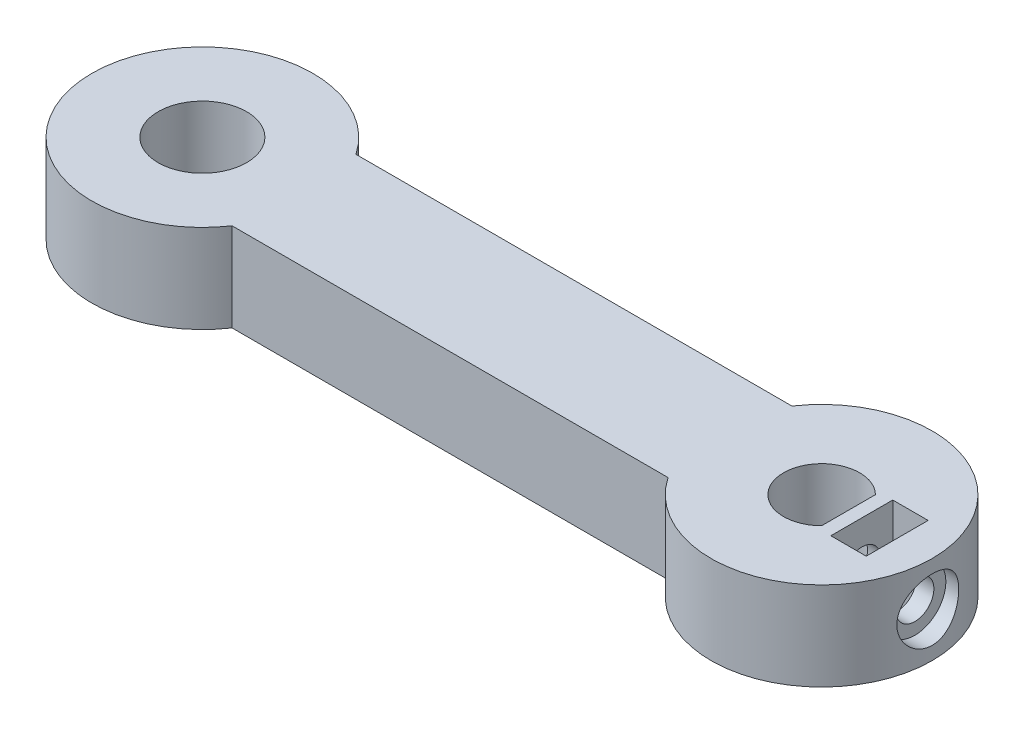
ISO-10303-21;
HEADER;
FILE_DESCRIPTION(('STEP AP214'),'2;1');
FILE_NAME('part.step','',(''),(''),'','','');
FILE_SCHEMA(('AUTOMOTIVE_DESIGN { 1 0 10303 214 1 1 1 1 }'));
ENDSEC;
DATA;
#1=APPLICATION_CONTEXT('core data for automotive mechanical design processes');
#2=APPLICATION_PROTOCOL_DEFINITION('international standard','automotive_design',2000,#1);
#3=PRODUCT_CONTEXT('',#1,'mechanical');
#4=PRODUCT('Part','Part','',(#3));
#5=PRODUCT_RELATED_PRODUCT_CATEGORY('part','',(#4));
#6=PRODUCT_DEFINITION_FORMATION('','',#4);
#7=PRODUCT_DEFINITION_CONTEXT('part definition',#1,'design');
#8=PRODUCT_DEFINITION('design','',#6,#7);
#9=PRODUCT_DEFINITION_SHAPE('','',#8);
#10=(LENGTH_UNIT() NAMED_UNIT(*) SI_UNIT(.MILLI.,.METRE.));
#11=(NAMED_UNIT(*) PLANE_ANGLE_UNIT() SI_UNIT($,.RADIAN.));
#12=(NAMED_UNIT(*) SI_UNIT($,.STERADIAN.) SOLID_ANGLE_UNIT());
#13=UNCERTAINTY_MEASURE_WITH_UNIT(LENGTH_MEASURE(1.E-05),#10,'distance_accuracy_value','');
#14=(GEOMETRIC_REPRESENTATION_CONTEXT(3) GLOBAL_UNCERTAINTY_ASSIGNED_CONTEXT((#13)) GLOBAL_UNIT_ASSIGNED_CONTEXT((#10,
#11,#12)) REPRESENTATION_CONTEXT('',''));
#15=CARTESIAN_POINT('',(0.,0.,0.));
#16=DIRECTION('',(0.,0.,1.));
#17=DIRECTION('',(1.,0.,0.));
#18=AXIS2_PLACEMENT_3D('',#15,#16,#17);
#19=CARTESIAN_POINT('',(82.5,5.,0.));
#20=DIRECTION('',(-1.,0.,0.));
#21=DIRECTION('',(0.,0.,1.));
#22=AXIS2_PLACEMENT_3D('',#19,#20,#21);
#23=CYLINDRICAL_SURFACE('',#22,2.15);
#24=CARTESIAN_POINT('',(74.5405591591022,5.,0.));
#25=DIRECTION('',(-1.,0.,0.));
#26=DIRECTION('',(0.,0.,1.));
#27=AXIS2_PLACEMENT_3D('',#24,#25,#26);
#28=CIRCLE('',#27,2.15);
#29=CARTESIAN_POINT('',(74.5405591591022,5.,2.15));
#30=VERTEX_POINT('',#29);
#31=EDGE_CURVE('E171',#30,#30,#28,.F.);
#32=ORIENTED_EDGE('',*,*,#31,.T.);
#33=EDGE_LOOP('',(#32));
#34=FACE_BOUND('',#33,.T.);
#35=CARTESIAN_POINT('',(73.0405591591022,5.,0.));
#36=DIRECTION('',(-1.,0.,0.));
#37=DIRECTION('',(0.,0.,1.));
#38=AXIS2_PLACEMENT_3D('',#35,#36,#37);
#39=CIRCLE('',#38,2.15);
#40=CARTESIAN_POINT('',(73.0405591591022,5.,2.15));
#41=VERTEX_POINT('',#40);
#42=EDGE_CURVE('E166',#41,#41,#39,.T.);
#43=ORIENTED_EDGE('',*,*,#42,.T.);
#44=EDGE_LOOP('',(#43));
#45=FACE_BOUND('',#44,.T.);
#46=ADVANCED_FACE('F40',(#34,#45),#23,.F.);
#47=CARTESIAN_POINT('',(70.,10.,0.));
#48=DIRECTION('',(0.,-1.,0.));
#49=DIRECTION('',(0.,0.,-1.));
#50=AXIS2_PLACEMENT_3D('',#47,#48,#49);
#51=CYLINDRICAL_SURFACE('',#50,12.5);
#52=CARTESIAN_POINT('',(82.,5.,3.5));
#53=CARTESIAN_POINT('',(82.0000029182384,5.19241482471694,3.49999615237465));
#54=CARTESIAN_POINT('',(82.0046785544293,5.38486904113279,3.48407876334716));
#55=CARTESIAN_POINT('',(82.0228128498503,5.76419285408233,3.4209669850466));
#56=CARTESIAN_POINT('',(82.0362753342026,5.95105998135639,3.37375897408939));
#57=CARTESIAN_POINT('',(82.0703417038929,6.31366626686079,3.24976086719817));
#58=CARTESIAN_POINT('',(82.090934840205,6.4894217063548,3.17301527806614));
#59=CARTESIAN_POINT('',(82.136928168491,6.82559653988916,2.99226282033337));
#60=CARTESIAN_POINT('',(82.1623288716688,6.98601430029293,2.88825305219341));
#61=CARTESIAN_POINT('',(82.2158603074866,7.29138245972694,2.65285688670778));
#62=CARTESIAN_POINT('',(82.2440433222755,7.43584740987041,2.52085249343853));
#63=CARTESIAN_POINT('',(82.2995144458836,7.70090525334718,2.23454150476459));
#64=CARTESIAN_POINT('',(82.3268024534156,7.82149545251975,2.08023239576612));
#65=CARTESIAN_POINT('',(82.3779964293708,8.03743724729167,1.75029227363635));
#66=CARTESIAN_POINT('',(82.4018335593885,8.13230144101637,1.57433065035375));
#67=CARTESIAN_POINT('',(82.4428371907732,8.29091151371921,1.20817457795226));
#68=CARTESIAN_POINT('',(82.4600049370697,8.35466320083208,1.01798279299538));
#69=CARTESIAN_POINT('',(82.4853656892475,8.44765379209681,0.633837060621716));
#70=CARTESIAN_POINT('',(82.4937733520519,8.47771960102609,0.440097705604599));
#71=CARTESIAN_POINT('',(82.5014192399288,8.50509163122306,0.0501545766813506));
#72=CARTESIAN_POINT('',(82.5006591508232,8.50240387541411,-0.146048737508466));
#73=CARTESIAN_POINT('',(82.4902103188576,8.4649168611338,-0.529577185864376));
#74=CARTESIAN_POINT('',(82.4807702097015,8.43101176722193,-0.71699753814503));
#75=CARTESIAN_POINT('',(82.4543187948504,8.3335032678199,-1.08337362960878));
#76=CARTESIAN_POINT('',(82.4373070367162,8.2698980876089,-1.26232886225703));
#77=CARTESIAN_POINT('',(82.3972647344828,8.11414101074105,-1.60891633543912));
#78=CARTESIAN_POINT('',(82.3741720778001,8.0216925844915,-1.77640784364429));
#79=CARTESIAN_POINT('',(82.3244414260413,7.81110340010356,-2.09379770763226));
#80=CARTESIAN_POINT('',(82.2978026803105,7.69295719875908,-2.24369232573499));
#81=CARTESIAN_POINT('',(82.2427920342732,7.42962076074637,-2.52697175983478));
#82=CARTESIAN_POINT('',(82.2143919832095,7.28365235983582,-2.659628625146));
#83=CARTESIAN_POINT('',(82.1598610870606,6.97125218923845,-2.89876928059095));
#84=CARTESIAN_POINT('',(82.1337304113857,6.80481889407119,-3.00525111782679));
#85=CARTESIAN_POINT('',(82.0865750163485,6.45450555003066,-3.18965050384757));
#86=CARTESIAN_POINT('',(82.0655895187615,6.27050549056501,-3.2673508087337));
#87=CARTESIAN_POINT('',(82.0315777632379,5.89131574546498,-3.39046632280532));
#88=CARTESIAN_POINT('',(82.0185492959839,5.69612918230984,-3.43589049422665));
#89=CARTESIAN_POINT('',(82.0024030241429,5.30696224337218,-3.49186889507213));
#90=CARTESIAN_POINT('',(81.9989744317497,5.11315195446068,-3.50351705492387));
#91=CARTESIAN_POINT('',(82.0015622285673,4.72634886830408,-3.49464270434572));
#92=CARTESIAN_POINT('',(82.0075774936583,4.53335597650443,-3.4741240227947));
#93=CARTESIAN_POINT('',(82.028073112858,4.15801314672978,-3.4024668578895));
#94=CARTESIAN_POINT('',(82.04236656542,3.97552303760434,-3.35200384613666));
#95=CARTESIAN_POINT('',(82.0776211582942,3.6216020678571,-3.22265905357544));
#96=CARTESIAN_POINT('',(82.0985832334134,3.45017276179303,-3.14377328826114));
#97=CARTESIAN_POINT('',(82.1454373448376,3.11871217063697,-2.95765848560496));
#98=CARTESIAN_POINT('',(82.1714352674676,2.9590513899883,-2.84979689170067));
#99=CARTESIAN_POINT('',(82.2251912476975,2.65969475593594,-2.60956338877969));
#100=CARTESIAN_POINT('',(82.252949670482,2.52000306444997,-2.4771863834684));
#101=CARTESIAN_POINT('',(82.3081829234522,2.259915272377,-2.18658730527812));
#102=CARTESIAN_POINT('',(82.3356197147011,2.14028705083794,-2.02766922094411));
#103=CARTESIAN_POINT('',(82.3862060696637,1.92939507383442,-1.69138037520718));
#104=CARTESIAN_POINT('',(82.4093558598585,1.8381298197905,-1.51401058937542));
#105=CARTESIAN_POINT('',(82.4486113106072,1.68741794147627,-1.14709270155203));
#106=CARTESIAN_POINT('',(82.4647700697764,1.62773067267032,-0.957649404949926));
#107=CARTESIAN_POINT('',(82.4884571543435,1.54119701909795,-0.570896024719841));
#108=CARTESIAN_POINT('',(82.4959876046799,1.51434254831889,-0.373587890397937));
#109=CARTESIAN_POINT('',(82.5014579192325,1.49478600879999,0.0161518687345293));
#110=CARTESIAN_POINT('',(82.4997126237562,1.50096282659091,0.208523574951645));
#111=CARTESIAN_POINT('',(82.4875511892792,1.54466064769149,0.589378135061154));
#112=CARTESIAN_POINT('',(82.4771354371761,1.5821802524079,0.777861162091557));
#113=CARTESIAN_POINT('',(82.4488768980247,1.68683976736079,1.14409378229176));
#114=CARTESIAN_POINT('',(82.4310963476457,1.75373174280421,1.32191935297357));
#115=CARTESIAN_POINT('',(82.3899581514136,1.91501668800085,1.66392283507005));
#116=CARTESIAN_POINT('',(82.3665996654369,2.00941380092607,1.82809868559873));
#117=CARTESIAN_POINT('',(82.3159487927087,2.22619499704474,2.14327684605593));
#118=CARTESIAN_POINT('',(82.288562432791,2.34930725507261,2.29376313547136));
#119=CARTESIAN_POINT('',(82.2332900651242,2.61867029744508,2.57231846002994));
#120=CARTESIAN_POINT('',(82.205403923321,2.76492737473764,2.70038137837703));
#121=CARTESIAN_POINT('',(82.1514815437646,3.08081187043231,2.93363501349732));
#122=CARTESIAN_POINT('',(82.1255087622321,3.25093104538473,3.03817587370694));
#123=CARTESIAN_POINT('',(82.0792917300542,3.6070366519168,3.21703260079249));
#124=CARTESIAN_POINT('',(82.059044105996,3.79301365520643,3.29136627786827));
#125=CARTESIAN_POINT('',(82.0290742856874,4.14830474944435,3.39912168142636));
#126=CARTESIAN_POINT('',(82.0182651534564,4.3162303981293,3.43685652188098));
#127=CARTESIAN_POINT('',(82.0037272136938,4.65609392846837,3.48729560764387));
#128=CARTESIAN_POINT('',(81.9999973918545,4.82803123176759,3.50000343877554));
#129=CARTESIAN_POINT('',(82.,5.,3.5));
#130=B_SPLINE_CURVE_WITH_KNOTS('',3,(#52,#53,#54,#55,#56,#57,#58,#59,#60,#61,#62,#63,#64,#65,
#66,#67,#68,#69,#70,#71,#72,#73,#74,#75,#76,#77,#78,#79,#80,#81,#82,#83,#84,#85,#86,#87,#88,#89,
#90,#91,#92,#93,#94,#95,#96,#97,#98,#99,#100,#101,#102,#103,#104,#105,#106,#107,#108,#109,#110,
#111,#112,#113,#114,#115,#116,#117,#118,#119,#120,#121,#122,#123,#124,#125,#126,#127,#128,#129),
.UNSPECIFIED.,.T.,.F.,(4,2,2,2,2,2,2,2,2,2,2,2,2,2,2,2,2,2,2,2,2,2,2,2,2,2,2,2,2,2,2,2,2,2,2,2,
2,2,4),(0.,0.576611367799128,1.1534739156828,1.72947063688369,2.30552864007483,2.89595138133578,
3.4864407112803,4.08743969019363,4.68832643065514,5.27411559708618,5.85979704669186,
6.42920767019322,6.99865232303129,7.57415572555732,8.14978114796735,8.7448340478493,
9.33993133068583,9.93943306827215,10.5387682748256,11.1184628491913,11.6980884266742,
12.2651111154848,12.8322133245598,13.4128741853846,13.9936558904935,14.5931741279638,
15.1926606840338,15.7875104510376,16.382213689797,16.9568630014037,17.5314866720958,
18.1013504374819,18.6713000873781,19.2576755819283,19.8442107835225,20.4453695275071,
21.046173311345,21.5615876367408,22.0769281091555),.UNSPECIFIED.);
#131=CARTESIAN_POINT('',(82.,5.,3.5));
#132=VERTEX_POINT('',#131);
#133=EDGE_CURVE('E45',#132,#132,#130,.T.);
#134=ORIENTED_EDGE('',*,*,#133,.T.);
#135=EDGE_LOOP('',(#134));
#136=FACE_BOUND('',#135,.T.);
#137=CARTESIAN_POINT('',(70.,0.,0.));
#138=DIRECTION('',(0.,1.,0.));
#139=DIRECTION('',(0.,0.,1.));
#140=AXIS2_PLACEMENT_3D('',#137,#138,#139);
#141=CIRCLE('',#140,12.5);
#142=CARTESIAN_POINT('',(59.643842411396,0.,7.));
#143=VERTEX_POINT('',#142);
#144=CARTESIAN_POINT('',(59.643842411396,0.,-7.));
#145=VERTEX_POINT('',#144);
#146=EDGE_CURVE('E181',#143,#145,#141,.T.);
#147=ORIENTED_EDGE('',*,*,#146,.T.);
#148=DIRECTION('',(0.,-1.,0.));
#149=VECTOR('',#148,1.);
#150=CARTESIAN_POINT('',(59.643842411396,10.,-7.));
#151=LINE('',#150,#149);
#152=CARTESIAN_POINT('',(59.643842411396,10.,-7.));
#153=VERTEX_POINT('',#152);
#154=EDGE_CURVE('E11',#153,#145,#151,.T.);
#155=ORIENTED_EDGE('',*,*,#154,.F.);
#156=CARTESIAN_POINT('',(70.,10.,0.));
#157=DIRECTION('',(0.,1.,0.));
#158=DIRECTION('',(0.,0.,1.));
#159=AXIS2_PLACEMENT_3D('',#156,#157,#158);
#160=CIRCLE('',#159,12.5);
#161=CARTESIAN_POINT('',(59.643842411396,10.,7.));
#162=VERTEX_POINT('',#161);
#163=EDGE_CURVE('E201',#162,#153,#160,.T.);
#164=ORIENTED_EDGE('',*,*,#163,.F.);
#165=DIRECTION('',(0.,-1.,0.));
#166=VECTOR('',#165,1.);
#167=CARTESIAN_POINT('',(59.643842411396,10.,7.));
#168=LINE('',#167,#166);
#169=EDGE_CURVE('E215',#162,#143,#168,.T.);
#170=ORIENTED_EDGE('',*,*,#169,.T.);
#171=EDGE_LOOP('',(#147,#155,#164,#170));
#172=FACE_BOUND('',#171,.T.);
#173=ADVANCED_FACE('F42',(#136,#172),#51,.T.);
#174=CARTESIAN_POINT('',(10.356157588604,10.,-7.));
#175=DIRECTION('',(0.,0.,1.));
#176=DIRECTION('',(1.,0.,0.));
#177=AXIS2_PLACEMENT_3D('',#174,#175,#176);
#178=PLANE('',#177);
#179=DIRECTION('',(-1.,0.,0.));
#180=VECTOR('',#179,1.);
#181=CARTESIAN_POINT('',(10.356157588604,0.,-7.));
#182=LINE('',#181,#180);
#183=CARTESIAN_POINT('',(10.356157588604,0.,-7.));
#184=VERTEX_POINT('',#183);
#185=EDGE_CURVE('E219',#145,#184,#182,.T.);
#186=ORIENTED_EDGE('',*,*,#185,.T.);
#187=DIRECTION('',(0.,-1.,0.));
#188=VECTOR('',#187,1.);
#189=CARTESIAN_POINT('',(10.356157588604,10.,-7.));
#190=LINE('',#189,#188);
#191=CARTESIAN_POINT('',(10.356157588604,10.,-7.));
#192=VERTEX_POINT('',#191);
#193=EDGE_CURVE('E55',#192,#184,#190,.T.);
#194=ORIENTED_EDGE('',*,*,#193,.F.);
#195=DIRECTION('',(-1.,0.,0.));
#196=VECTOR('',#195,1.);
#197=CARTESIAN_POINT('',(10.356157588604,10.,-7.));
#198=LINE('',#197,#196);
#199=EDGE_CURVE('E205',#153,#192,#198,.T.);
#200=ORIENTED_EDGE('',*,*,#199,.F.);
#201=ORIENTED_EDGE('',*,*,#154,.T.);
#202=EDGE_LOOP('',(#186,#194,#200,#201));
#203=FACE_BOUND('',#202,.T.);
#204=ADVANCED_FACE('F297',(#203),#178,.F.);
#205=CARTESIAN_POINT('',(0.,10.,0.));
#206=DIRECTION('',(0.,-1.,0.));
#207=DIRECTION('',(0.,0.,-1.));
#208=AXIS2_PLACEMENT_3D('',#205,#206,#207);
#209=CYLINDRICAL_SURFACE('',#208,12.5);
#210=CARTESIAN_POINT('',(0.,0.,0.));
#211=DIRECTION('',(0.,1.,0.));
#212=DIRECTION('',(0.,0.,1.));
#213=AXIS2_PLACEMENT_3D('',#210,#211,#212);
#214=CIRCLE('',#213,12.5);
#215=CARTESIAN_POINT('',(10.356157588604,0.,7.));
#216=VERTEX_POINT('',#215);
#217=EDGE_CURVE('E222',#184,#216,#214,.T.);
#218=ORIENTED_EDGE('',*,*,#217,.T.);
#219=DIRECTION('',(0.,-1.,0.));
#220=VECTOR('',#219,1.);
#221=CARTESIAN_POINT('',(10.356157588604,10.,7.));
#222=LINE('',#221,#220);
#223=CARTESIAN_POINT('',(10.356157588604,10.,7.));
#224=VERTEX_POINT('',#223);
#225=EDGE_CURVE('E230',#224,#216,#222,.T.);
#226=ORIENTED_EDGE('',*,*,#225,.F.);
#227=CARTESIAN_POINT('',(0.,10.,0.));
#228=DIRECTION('',(0.,1.,0.));
#229=DIRECTION('',(0.,0.,1.));
#230=AXIS2_PLACEMENT_3D('',#227,#228,#229);
#231=CIRCLE('',#230,12.5);
#232=EDGE_CURVE('E209',#192,#224,#231,.T.);
#233=ORIENTED_EDGE('',*,*,#232,.F.);
#234=ORIENTED_EDGE('',*,*,#193,.T.);
#235=EDGE_LOOP('',(#218,#226,#233,#234));
#236=FACE_BOUND('',#235,.T.);
#237=ADVANCED_FACE('F294',(#236),#209,.T.);
#238=CARTESIAN_POINT('',(10.356157588604,10.,7.));
#239=DIRECTION('',(0.,0.,-1.));
#240=DIRECTION('',(-1.,0.,0.));
#241=AXIS2_PLACEMENT_3D('',#238,#239,#240);
#242=PLANE('',#241);
#243=DIRECTION('',(1.,0.,0.));
#244=VECTOR('',#243,1.);
#245=CARTESIAN_POINT('',(10.356157588604,0.,7.));
#246=LINE('',#245,#244);
#247=EDGE_CURVE('E206',#216,#143,#246,.T.);
#248=ORIENTED_EDGE('',*,*,#247,.T.);
#249=ORIENTED_EDGE('',*,*,#169,.F.);
#250=DIRECTION('',(1.,0.,0.));
#251=VECTOR('',#250,1.);
#252=CARTESIAN_POINT('',(10.356157588604,10.,7.));
#253=LINE('',#252,#251);
#254=EDGE_CURVE('E212',#224,#162,#253,.T.);
#255=ORIENTED_EDGE('',*,*,#254,.F.);
#256=ORIENTED_EDGE('',*,*,#225,.T.);
#257=EDGE_LOOP('',(#248,#249,#255,#256));
#258=FACE_BOUND('',#257,.T.);
#259=ADVANCED_FACE('F290',(#258),#242,.F.);
#260=CARTESIAN_POINT('',(70.,10.,0.));
#261=DIRECTION('',(0.,1.,0.));
#262=DIRECTION('',(0.,0.,1.));
#263=AXIS2_PLACEMENT_3D('',#260,#261,#262);
#264=PLANE('',#263);
#265=DIRECTION('',(0.,0.,1.));
#266=VECTOR('',#265,1.);
#267=CARTESIAN_POINT('',(74.5405591591022,10.,-3.5));
#268=LINE('',#267,#266);
#269=CARTESIAN_POINT('',(74.5405591591022,10.,-3.5));
#270=VERTEX_POINT('',#269);
#271=CARTESIAN_POINT('',(74.5405591591022,10.,3.5));
#272=VERTEX_POINT('',#271);
#273=EDGE_CURVE('E63',#270,#272,#268,.T.);
#274=ORIENTED_EDGE('',*,*,#273,.F.);
#275=DIRECTION('',(-1.,0.,0.));
#276=VECTOR('',#275,1.);
#277=CARTESIAN_POINT('',(74.5405591591022,10.,-3.5));
#278=LINE('',#277,#276);
#279=CARTESIAN_POINT('',(78.5405591591022,10.,-3.5));
#280=VERTEX_POINT('',#279);
#281=EDGE_CURVE('E147',#280,#270,#278,.T.);
#282=ORIENTED_EDGE('',*,*,#281,.F.);
#283=DIRECTION('',(0.,0.,-1.));
#284=VECTOR('',#283,1.);
#285=CARTESIAN_POINT('',(78.5405591591022,10.,-3.5));
#286=LINE('',#285,#284);
#287=CARTESIAN_POINT('',(78.5405591591022,10.,3.5));
#288=VERTEX_POINT('',#287);
#289=EDGE_CURVE('E129',#288,#280,#286,.T.);
#290=ORIENTED_EDGE('',*,*,#289,.F.);
#291=DIRECTION('',(1.,0.,0.));
#292=VECTOR('',#291,1.);
#293=CARTESIAN_POINT('',(74.5405591591022,10.,3.5));
#294=LINE('',#293,#292);
#295=EDGE_CURVE('E139',#272,#288,#294,.T.);
#296=ORIENTED_EDGE('',*,*,#295,.F.);
#297=EDGE_LOOP('',(#274,#282,#290,#296));
#298=FACE_BOUND('',#297,.T.);
#299=CARTESIAN_POINT('',(0.,10.,0.));
#300=DIRECTION('',(0.,1.,0.));
#301=DIRECTION('',(0.,0.,1.));
#302=AXIS2_PLACEMENT_3D('',#299,#300,#301);
#303=CIRCLE('',#302,5.);
#304=CARTESIAN_POINT('',(0.,10.,5.));
#305=VERTEX_POINT('',#304);
#306=EDGE_CURVE('E172',#305,#305,#303,.T.);
#307=ORIENTED_EDGE('',*,*,#306,.F.);
#308=EDGE_LOOP('',(#307));
#309=FACE_BOUND('',#308,.T.);
#310=CARTESIAN_POINT('',(70.,10.,0.));
#311=DIRECTION('',(0.,1.,0.));
#312=DIRECTION('',(0.,0.,-1.));
#313=AXIS2_PLACEMENT_3D('',#310,#311,#312);
#314=CIRCLE('',#313,4.29999999999999);
#315=CARTESIAN_POINT('',(73.0405591591022,10.,-3.04055915910214));
#316=VERTEX_POINT('',#315);
#317=CARTESIAN_POINT('',(73.0405591591022,10.,3.04055915910214));
#318=VERTEX_POINT('',#317);
#319=EDGE_CURVE('E170',#316,#318,#314,.T.);
#320=ORIENTED_EDGE('',*,*,#319,.F.);
#321=DIRECTION('',(0.,0.,-1.));
#322=VECTOR('',#321,1.);
#323=CARTESIAN_POINT('',(73.0405591591022,10.,-3.04055915910214));
#324=LINE('',#323,#322);
#325=EDGE_CURVE('E189',#318,#316,#324,.T.);
#326=ORIENTED_EDGE('',*,*,#325,.F.);
#327=EDGE_LOOP('',(#320,#326));
#328=FACE_BOUND('',#327,.T.);
#329=ORIENTED_EDGE('',*,*,#163,.T.);
#330=ORIENTED_EDGE('',*,*,#199,.T.);
#331=ORIENTED_EDGE('',*,*,#232,.T.);
#332=ORIENTED_EDGE('',*,*,#254,.T.);
#333=EDGE_LOOP('',(#329,#330,#331,#332));
#334=FACE_BOUND('',#333,.T.);
#335=ADVANCED_FACE('F144',(#298,#309,#328,#334),#264,.T.);
#336=CARTESIAN_POINT('',(70.,0.,0.));
#337=DIRECTION('',(0.,1.,0.));
#338=DIRECTION('',(0.,0.,1.));
#339=AXIS2_PLACEMENT_3D('',#336,#337,#338);
#340=PLANE('',#339);
#341=DIRECTION('',(1.,0.,0.));
#342=VECTOR('',#341,1.);
#343=CARTESIAN_POINT('',(74.5405591591022,0.,-3.5));
#344=LINE('',#343,#342);
#345=CARTESIAN_POINT('',(74.5405591591022,0.,-3.5));
#346=VERTEX_POINT('',#345);
#347=CARTESIAN_POINT('',(78.5405591591022,0.,-3.5));
#348=VERTEX_POINT('',#347);
#349=EDGE_CURVE('E258',#346,#348,#344,.T.);
#350=ORIENTED_EDGE('',*,*,#349,.F.);
#351=DIRECTION('',(0.,0.,-1.));
#352=VECTOR('',#351,1.);
#353=CARTESIAN_POINT('',(74.5405591591022,0.,-3.5));
#354=LINE('',#353,#352);
#355=CARTESIAN_POINT('',(74.5405591591022,0.,3.5));
#356=VERTEX_POINT('',#355);
#357=EDGE_CURVE('E165',#356,#346,#354,.T.);
#358=ORIENTED_EDGE('',*,*,#357,.F.);
#359=DIRECTION('',(-1.,0.,0.));
#360=VECTOR('',#359,1.);
#361=CARTESIAN_POINT('',(74.5405591591022,0.,3.5));
#362=LINE('',#361,#360);
#363=CARTESIAN_POINT('',(78.5405591591022,0.,3.5));
#364=VERTEX_POINT('',#363);
#365=EDGE_CURVE('E161',#364,#356,#362,.T.);
#366=ORIENTED_EDGE('',*,*,#365,.F.);
#367=DIRECTION('',(0.,0.,1.));
#368=VECTOR('',#367,1.);
#369=CARTESIAN_POINT('',(78.5405591591022,0.,-3.5));
#370=LINE('',#369,#368);
#371=EDGE_CURVE('E132',#348,#364,#370,.T.);
#372=ORIENTED_EDGE('',*,*,#371,.F.);
#373=EDGE_LOOP('',(#350,#358,#366,#372));
#374=FACE_BOUND('',#373,.T.);
#375=CARTESIAN_POINT('',(0.,0.,0.));
#376=DIRECTION('',(0.,1.,0.));
#377=DIRECTION('',(0.,0.,1.));
#378=AXIS2_PLACEMENT_3D('',#375,#376,#377);
#379=CIRCLE('',#378,5.);
#380=CARTESIAN_POINT('',(0.,0.,5.));
#381=VERTEX_POINT('',#380);
#382=EDGE_CURVE('E176',#381,#381,#379,.F.);
#383=ORIENTED_EDGE('',*,*,#382,.F.);
#384=EDGE_LOOP('',(#383));
#385=FACE_BOUND('',#384,.T.);
#386=DIRECTION('',(0.,0.,1.));
#387=VECTOR('',#386,1.);
#388=CARTESIAN_POINT('',(73.0405591591022,0.,-3.04055915910214));
#389=LINE('',#388,#387);
#390=CARTESIAN_POINT('',(73.0405591591022,0.,-3.04055915910214));
#391=VERTEX_POINT('',#390);
#392=CARTESIAN_POINT('',(73.0405591591022,0.,3.04055915910214));
#393=VERTEX_POINT('',#392);
#394=EDGE_CURVE('E177',#391,#393,#389,.T.);
#395=ORIENTED_EDGE('',*,*,#394,.F.);
#396=CARTESIAN_POINT('',(70.,0.,0.));
#397=DIRECTION('',(0.,1.,0.));
#398=DIRECTION('',(0.,0.,1.));
#399=AXIS2_PLACEMENT_3D('',#396,#397,#398);
#400=CIRCLE('',#399,4.29999999999999);
#401=EDGE_CURVE('E182',#393,#391,#400,.F.);
#402=ORIENTED_EDGE('',*,*,#401,.F.);
#403=EDGE_LOOP('',(#395,#402));
#404=FACE_BOUND('',#403,.T.);
#405=ORIENTED_EDGE('',*,*,#146,.F.);
#406=ORIENTED_EDGE('',*,*,#247,.F.);
#407=ORIENTED_EDGE('',*,*,#217,.F.);
#408=ORIENTED_EDGE('',*,*,#185,.F.);
#409=EDGE_LOOP('',(#405,#406,#407,#408));
#410=FACE_BOUND('',#409,.T.);
#411=ADVANCED_FACE('F271',(#374,#385,#404,#410),#340,.F.);
#412=CARTESIAN_POINT('',(70.,-14.142135623731,0.));
#413=DIRECTION('',(0.,1.,0.));
#414=DIRECTION('',(0.,0.,1.));
#415=AXIS2_PLACEMENT_3D('',#412,#413,#414);
#416=CYLINDRICAL_SURFACE('',#415,4.29999999999999);
#417=ORIENTED_EDGE('',*,*,#401,.T.);
#418=DIRECTION('',(0.,1.,0.));
#419=VECTOR('',#418,1.);
#420=CARTESIAN_POINT('',(73.0405591591022,-14.142135623731,-3.04055915910214));
#421=LINE('',#420,#419);
#422=EDGE_CURVE('E186',#391,#316,#421,.T.);
#423=ORIENTED_EDGE('',*,*,#422,.T.);
#424=ORIENTED_EDGE('',*,*,#319,.T.);
#425=DIRECTION('',(0.,1.,0.));
#426=VECTOR('',#425,1.);
#427=CARTESIAN_POINT('',(73.0405591591022,-14.142135623731,3.04055915910214));
#428=LINE('',#427,#426);
#429=EDGE_CURVE('E193',#393,#318,#428,.T.);
#430=ORIENTED_EDGE('',*,*,#429,.F.);
#431=EDGE_LOOP('',(#417,#423,#424,#430));
#432=FACE_BOUND('',#431,.T.);
#433=ADVANCED_FACE('F274',(#432),#416,.F.);
#434=CARTESIAN_POINT('',(73.0405591591022,-14.142135623731,-3.04055915910214));
#435=DIRECTION('',(1.,0.,0.));
#436=DIRECTION('',(0.,0.,-1.));
#437=AXIS2_PLACEMENT_3D('',#434,#435,#436);
#438=PLANE('',#437);
#439=ORIENTED_EDGE('',*,*,#42,.F.);
#440=EDGE_LOOP('',(#439));
#441=FACE_BOUND('',#440,.T.);
#442=ORIENTED_EDGE('',*,*,#394,.T.);
#443=ORIENTED_EDGE('',*,*,#429,.T.);
#444=ORIENTED_EDGE('',*,*,#325,.T.);
#445=ORIENTED_EDGE('',*,*,#422,.F.);
#446=EDGE_LOOP('',(#442,#443,#444,#445));
#447=FACE_BOUND('',#446,.T.);
#448=ADVANCED_FACE('F323',(#441,#447),#438,.F.);
#449=CARTESIAN_POINT('',(0.,-14.142135623731,0.));
#450=DIRECTION('',(0.,1.,0.));
#451=DIRECTION('',(0.,0.,1.));
#452=AXIS2_PLACEMENT_3D('',#449,#450,#451);
#453=CYLINDRICAL_SURFACE('',#452,5.);
#454=ORIENTED_EDGE('',*,*,#382,.T.);
#455=EDGE_LOOP('',(#454));
#456=FACE_BOUND('',#455,.T.);
#457=ORIENTED_EDGE('',*,*,#306,.T.);
#458=EDGE_LOOP('',(#457));
#459=FACE_BOUND('',#458,.T.);
#460=ADVANCED_FACE('F318',(#456,#459),#453,.F.);
#461=CARTESIAN_POINT('',(80.5405591591022,5.,0.));
#462=DIRECTION('',(-1.,0.,0.));
#463=DIRECTION('',(0.,0.,1.));
#464=AXIS2_PLACEMENT_3D('',#461,#462,#463);
#465=CIRCLE('',#464,2.15);
#466=CARTESIAN_POINT('',(80.5405591591022,5.,2.15));
#467=VERTEX_POINT('',#466);
#468=EDGE_CURVE('E242',#467,#467,#465,.F.);
#469=ORIENTED_EDGE('',*,*,#468,.T.);
#470=EDGE_LOOP('',(#469));
#471=FACE_BOUND('',#470,.T.);
#472=CARTESIAN_POINT('',(78.5405591591022,5.,0.));
#473=DIRECTION('',(1.,0.,0.));
#474=DIRECTION('',(0.,0.,-1.));
#475=AXIS2_PLACEMENT_3D('',#472,#473,#474);
#476=CIRCLE('',#475,2.15);
#477=CARTESIAN_POINT('',(78.5405591591022,5.,-2.15));
#478=VERTEX_POINT('',#477);
#479=EDGE_CURVE('E164',#478,#478,#476,.F.);
#480=ORIENTED_EDGE('',*,*,#479,.T.);
#481=EDGE_LOOP('',(#480));
#482=FACE_BOUND('',#481,.T.);
#483=ADVANCED_FACE('F309',(#471,#482),#23,.F.);
#484=CARTESIAN_POINT('',(74.5405591591022,-8.06225774829855,-3.5));
#485=DIRECTION('',(-1.,0.,0.));
#486=DIRECTION('',(0.,0.,1.));
#487=AXIS2_PLACEMENT_3D('',#484,#485,#486);
#488=PLANE('',#487);
#489=ORIENTED_EDGE('',*,*,#357,.T.);
#490=DIRECTION('',(0.,1.,0.));
#491=VECTOR('',#490,1.);
#492=CARTESIAN_POINT('',(74.5405591591022,-8.06225774829855,-3.5));
#493=LINE('',#492,#491);
#494=EDGE_CURVE('E154',#346,#270,#493,.T.);
#495=ORIENTED_EDGE('',*,*,#494,.T.);
#496=ORIENTED_EDGE('',*,*,#273,.T.);
#497=DIRECTION('',(0.,1.,0.));
#498=VECTOR('',#497,1.);
#499=CARTESIAN_POINT('',(74.5405591591022,-8.06225774829855,3.5));
#500=LINE('',#499,#498);
#501=EDGE_CURVE('E136',#356,#272,#500,.T.);
#502=ORIENTED_EDGE('',*,*,#501,.F.);
#503=EDGE_LOOP('',(#489,#495,#496,#502));
#504=FACE_BOUND('',#503,.T.);
#505=ORIENTED_EDGE('',*,*,#31,.F.);
#506=EDGE_LOOP('',(#505));
#507=FACE_BOUND('',#506,.T.);
#508=ADVANCED_FACE('F265',(#504,#507),#488,.F.);
#509=CARTESIAN_POINT('',(78.5405591591022,-8.06225774829855,-3.5));
#510=DIRECTION('',(1.,0.,0.));
#511=DIRECTION('',(0.,0.,-1.));
#512=AXIS2_PLACEMENT_3D('',#509,#510,#511);
#513=PLANE('',#512);
#514=ORIENTED_EDGE('',*,*,#371,.T.);
#515=DIRECTION('',(0.,1.,0.));
#516=VECTOR('',#515,1.);
#517=CARTESIAN_POINT('',(78.5405591591022,-8.06225774829855,3.5));
#518=LINE('',#517,#516);
#519=EDGE_CURVE('E71',#364,#288,#518,.T.);
#520=ORIENTED_EDGE('',*,*,#519,.T.);
#521=ORIENTED_EDGE('',*,*,#289,.T.);
#522=DIRECTION('',(0.,1.,0.));
#523=VECTOR('',#522,1.);
#524=CARTESIAN_POINT('',(78.5405591591022,-8.06225774829855,-3.5));
#525=LINE('',#524,#523);
#526=EDGE_CURVE('E135',#348,#280,#525,.T.);
#527=ORIENTED_EDGE('',*,*,#526,.F.);
#528=EDGE_LOOP('',(#514,#520,#521,#527));
#529=FACE_BOUND('',#528,.T.);
#530=ORIENTED_EDGE('',*,*,#479,.F.);
#531=EDGE_LOOP('',(#530));
#532=FACE_BOUND('',#531,.T.);
#533=ADVANCED_FACE('F125',(#529,#532),#513,.F.);
#534=CARTESIAN_POINT('',(74.5405591591022,-8.06225774829855,-3.5));
#535=DIRECTION('',(0.,0.,-1.));
#536=DIRECTION('',(-1.,0.,0.));
#537=AXIS2_PLACEMENT_3D('',#534,#535,#536);
#538=PLANE('',#537);
#539=ORIENTED_EDGE('',*,*,#349,.T.);
#540=ORIENTED_EDGE('',*,*,#526,.T.);
#541=ORIENTED_EDGE('',*,*,#281,.T.);
#542=ORIENTED_EDGE('',*,*,#494,.F.);
#543=EDGE_LOOP('',(#539,#540,#541,#542));
#544=FACE_BOUND('',#543,.T.);
#545=ADVANCED_FACE('F270',(#544),#538,.F.);
#546=CARTESIAN_POINT('',(74.5405591591022,-8.06225774829855,3.5));
#547=DIRECTION('',(0.,0.,1.));
#548=DIRECTION('',(1.,0.,0.));
#549=AXIS2_PLACEMENT_3D('',#546,#547,#548);
#550=PLANE('',#549);
#551=ORIENTED_EDGE('',*,*,#365,.T.);
#552=ORIENTED_EDGE('',*,*,#501,.T.);
#553=ORIENTED_EDGE('',*,*,#295,.T.);
#554=ORIENTED_EDGE('',*,*,#519,.F.);
#555=EDGE_LOOP('',(#551,#552,#553,#554));
#556=FACE_BOUND('',#555,.T.);
#557=ADVANCED_FACE('F140',(#556),#550,.F.);
#558=CARTESIAN_POINT('',(85.5405591591022,5.,0.));
#559=DIRECTION('',(-1.,0.,0.));
#560=DIRECTION('',(0.,0.,1.));
#561=AXIS2_PLACEMENT_3D('',#558,#559,#560);
#562=CYLINDRICAL_SURFACE('',#561,3.5);
#563=CARTESIAN_POINT('',(80.5405591591022,5.,0.));
#564=DIRECTION('',(-1.,0.,0.));
#565=DIRECTION('',(0.,0.,1.));
#566=AXIS2_PLACEMENT_3D('',#563,#564,#565);
#567=CIRCLE('',#566,3.5);
#568=CARTESIAN_POINT('',(80.5405591591022,5.,3.5));
#569=VERTEX_POINT('',#568);
#570=EDGE_CURVE('E245',#569,#569,#567,.T.);
#571=ORIENTED_EDGE('',*,*,#570,.T.);
#572=EDGE_LOOP('',(#571));
#573=FACE_BOUND('',#572,.T.);
#574=ORIENTED_EDGE('',*,*,#133,.F.);
#575=EDGE_LOOP('',(#574));
#576=FACE_BOUND('',#575,.T.);
#577=ADVANCED_FACE('F335',(#573,#576),#562,.F.);
#578=CARTESIAN_POINT('',(80.5405591591022,5.,0.));
#579=DIRECTION('',(-1.,0.,0.));
#580=DIRECTION('',(0.,0.,1.));
#581=AXIS2_PLACEMENT_3D('',#578,#579,#580);
#582=PLANE('',#581);
#583=ORIENTED_EDGE('',*,*,#570,.F.);
#584=EDGE_LOOP('',(#583));
#585=FACE_BOUND('',#584,.T.);
#586=ORIENTED_EDGE('',*,*,#468,.F.);
#587=EDGE_LOOP('',(#586));
#588=FACE_BOUND('',#587,.T.);
#589=ADVANCED_FACE('F339',(#585,#588),#582,.F.);
#590=CLOSED_SHELL('',(#46,#173,#204,#237,#259,#335,#411,#433,#448,#460,#483,#508,#533,#545,#557,
#577,#589));
#591=MANIFOLD_SOLID_BREP('B2',#590);
#592=ADVANCED_BREP_SHAPE_REPRESENTATION('',(#18,#591),#14);
#593=SHAPE_DEFINITION_REPRESENTATION(#9,#592);
ENDSEC;
END-ISO-10303-21;
